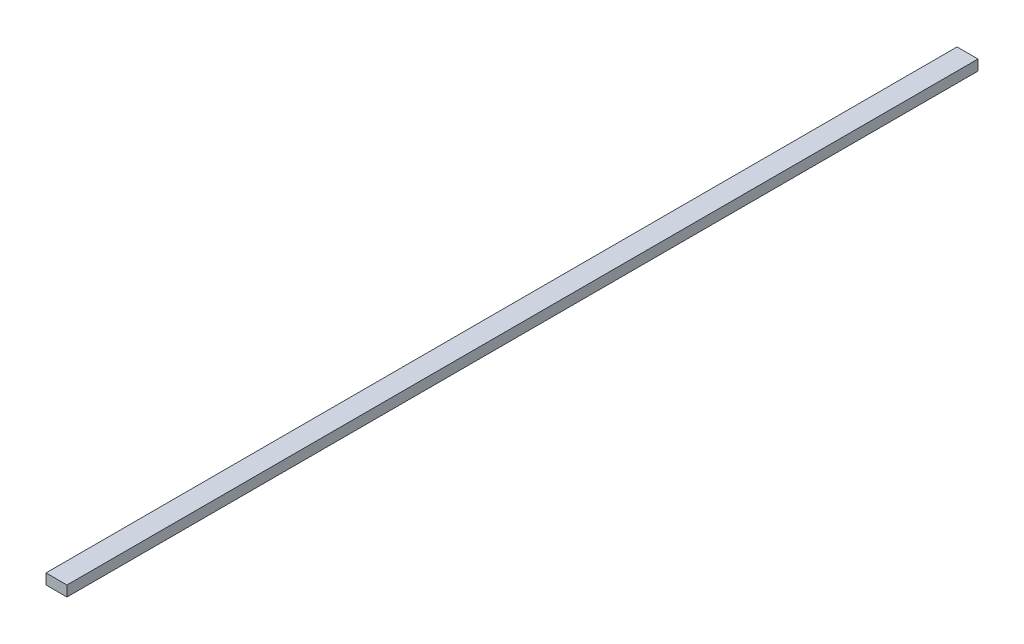
ISO-10303-21;
HEADER;
FILE_DESCRIPTION(('STEP AP214'),'2;1');
FILE_NAME('part.step','',(''),(''),'','','');
FILE_SCHEMA(('AUTOMOTIVE_DESIGN { 1 0 10303 214 1 1 1 1 }'));
ENDSEC;
DATA;
#1=APPLICATION_CONTEXT('core data for automotive mechanical design processes');
#2=APPLICATION_PROTOCOL_DEFINITION('international standard','automotive_design',2000,#1);
#3=PRODUCT_CONTEXT('',#1,'mechanical');
#4=PRODUCT('Part','Part','',(#3));
#5=PRODUCT_RELATED_PRODUCT_CATEGORY('part','',(#4));
#6=PRODUCT_DEFINITION_FORMATION('','',#4);
#7=PRODUCT_DEFINITION_CONTEXT('part definition',#1,'design');
#8=PRODUCT_DEFINITION('design','',#6,#7);
#9=PRODUCT_DEFINITION_SHAPE('','',#8);
#10=(LENGTH_UNIT() NAMED_UNIT(*) SI_UNIT(.MILLI.,.METRE.));
#11=(NAMED_UNIT(*) PLANE_ANGLE_UNIT() SI_UNIT($,.RADIAN.));
#12=(NAMED_UNIT(*) SI_UNIT($,.STERADIAN.) SOLID_ANGLE_UNIT());
#13=UNCERTAINTY_MEASURE_WITH_UNIT(LENGTH_MEASURE(1.E-05),#10,'distance_accuracy_value','');
#14=(GEOMETRIC_REPRESENTATION_CONTEXT(3) GLOBAL_UNCERTAINTY_ASSIGNED_CONTEXT((#13)) GLOBAL_UNIT_ASSIGNED_CONTEXT((#10,
#11,#12)) REPRESENTATION_CONTEXT('',''));
#15=CARTESIAN_POINT('',(0.,0.,0.));
#16=DIRECTION('',(0.,0.,1.));
#17=DIRECTION('',(1.,0.,0.));
#18=AXIS2_PLACEMENT_3D('',#15,#16,#17);
#19=CARTESIAN_POINT('',(0.,12.7,0.));
#20=DIRECTION('',(1.,0.,0.));
#21=DIRECTION('',(0.,0.,-1.));
#22=AXIS2_PLACEMENT_3D('',#19,#20,#21);
#23=PLANE('',#22);
#24=DIRECTION('',(0.,0.,1.));
#25=VECTOR('',#24,1.);
#26=CARTESIAN_POINT('',(0.,0.,0.));
#27=LINE('',#26,#25);
#28=CARTESIAN_POINT('',(0.,0.,-1104.9));
#29=VERTEX_POINT('',#28);
#30=CARTESIAN_POINT('',(0.,0.,0.));
#31=VERTEX_POINT('',#30);
#32=EDGE_CURVE('E107',#29,#31,#27,.T.);
#33=ORIENTED_EDGE('',*,*,#32,.T.);
#34=DIRECTION('',(0.,-1.,0.));
#35=VECTOR('',#34,1.);
#36=CARTESIAN_POINT('',(0.,12.7,0.));
#37=LINE('',#36,#35);
#38=CARTESIAN_POINT('',(0.,12.7,0.));
#39=VERTEX_POINT('',#38);
#40=EDGE_CURVE('E11',#39,#31,#37,.T.);
#41=ORIENTED_EDGE('',*,*,#40,.F.);
#42=DIRECTION('',(0.,0.,1.));
#43=VECTOR('',#42,1.);
#44=CARTESIAN_POINT('',(0.,12.7,0.));
#45=LINE('',#44,#43);
#46=CARTESIAN_POINT('',(0.,12.7,-1104.9));
#47=VERTEX_POINT('',#46);
#48=EDGE_CURVE('E91',#47,#39,#45,.T.);
#49=ORIENTED_EDGE('',*,*,#48,.F.);
#50=DIRECTION('',(0.,-1.,0.));
#51=VECTOR('',#50,1.);
#52=CARTESIAN_POINT('',(0.,12.7,-1104.9));
#53=LINE('',#52,#51);
#54=EDGE_CURVE('E103',#47,#29,#53,.T.);
#55=ORIENTED_EDGE('',*,*,#54,.T.);
#56=EDGE_LOOP('',(#33,#41,#49,#55));
#57=FACE_BOUND('',#56,.T.);
#58=ADVANCED_FACE('F39',(#57),#23,.F.);
#59=CARTESIAN_POINT('',(0.,12.7,0.));
#60=DIRECTION('',(0.,0.,-1.));
#61=DIRECTION('',(-1.,0.,0.));
#62=AXIS2_PLACEMENT_3D('',#59,#60,#61);
#63=PLANE('',#62);
#64=DIRECTION('',(1.,0.,0.));
#65=VECTOR('',#64,1.);
#66=CARTESIAN_POINT('',(0.,0.,0.));
#67=LINE('',#66,#65);
#68=CARTESIAN_POINT('',(25.4,0.,0.));
#69=VERTEX_POINT('',#68);
#70=EDGE_CURVE('E96',#31,#69,#67,.T.);
#71=ORIENTED_EDGE('',*,*,#70,.T.);
#72=DIRECTION('',(0.,-1.,0.));
#73=VECTOR('',#72,1.);
#74=CARTESIAN_POINT('',(25.4,12.7,0.));
#75=LINE('',#74,#73);
#76=CARTESIAN_POINT('',(25.4,12.7,0.));
#77=VERTEX_POINT('',#76);
#78=EDGE_CURVE('E48',#77,#69,#75,.T.);
#79=ORIENTED_EDGE('',*,*,#78,.F.);
#80=DIRECTION('',(1.,0.,0.));
#81=VECTOR('',#80,1.);
#82=CARTESIAN_POINT('',(0.,12.7,0.));
#83=LINE('',#82,#81);
#84=EDGE_CURVE('E86',#39,#77,#83,.T.);
#85=ORIENTED_EDGE('',*,*,#84,.F.);
#86=ORIENTED_EDGE('',*,*,#40,.T.);
#87=EDGE_LOOP('',(#71,#79,#85,#86));
#88=FACE_BOUND('',#87,.T.);
#89=ADVANCED_FACE('F95',(#88),#63,.F.);
#90=CARTESIAN_POINT('',(25.4,12.7,0.));
#91=DIRECTION('',(-1.,0.,0.));
#92=DIRECTION('',(0.,0.,1.));
#93=AXIS2_PLACEMENT_3D('',#90,#91,#92);
#94=PLANE('',#93);
#95=DIRECTION('',(0.,0.,-1.));
#96=VECTOR('',#95,1.);
#97=CARTESIAN_POINT('',(25.4,0.,0.));
#98=LINE('',#97,#96);
#99=CARTESIAN_POINT('',(25.4,0.,-1104.9));
#100=VERTEX_POINT('',#99);
#101=EDGE_CURVE('E73',#69,#100,#98,.T.);
#102=ORIENTED_EDGE('',*,*,#101,.T.);
#103=DIRECTION('',(0.,-1.,0.));
#104=VECTOR('',#103,1.);
#105=CARTESIAN_POINT('',(25.4,12.7,-1104.9));
#106=LINE('',#105,#104);
#107=CARTESIAN_POINT('',(25.4,12.7,-1104.9));
#108=VERTEX_POINT('',#107);
#109=EDGE_CURVE('E98',#108,#100,#106,.T.);
#110=ORIENTED_EDGE('',*,*,#109,.F.);
#111=DIRECTION('',(0.,0.,-1.));
#112=VECTOR('',#111,1.);
#113=CARTESIAN_POINT('',(25.4,12.7,0.));
#114=LINE('',#113,#112);
#115=EDGE_CURVE('E89',#77,#108,#114,.T.);
#116=ORIENTED_EDGE('',*,*,#115,.F.);
#117=ORIENTED_EDGE('',*,*,#78,.T.);
#118=EDGE_LOOP('',(#102,#110,#116,#117));
#119=FACE_BOUND('',#118,.T.);
#120=ADVANCED_FACE('F99',(#119),#94,.F.);
#121=CARTESIAN_POINT('',(0.,12.7,-1104.9));
#122=DIRECTION('',(0.,0.,1.));
#123=DIRECTION('',(1.,0.,0.));
#124=AXIS2_PLACEMENT_3D('',#121,#122,#123);
#125=PLANE('',#124);
#126=DIRECTION('',(-1.,0.,0.));
#127=VECTOR('',#126,1.);
#128=CARTESIAN_POINT('',(0.,0.,-1104.9));
#129=LINE('',#128,#127);
#130=EDGE_CURVE('E79',#100,#29,#129,.T.);
#131=ORIENTED_EDGE('',*,*,#130,.T.);
#132=ORIENTED_EDGE('',*,*,#54,.F.);
#133=DIRECTION('',(-1.,0.,0.));
#134=VECTOR('',#133,1.);
#135=CARTESIAN_POINT('',(0.,12.7,-1104.9));
#136=LINE('',#135,#134);
#137=EDGE_CURVE('E56',#108,#47,#136,.T.);
#138=ORIENTED_EDGE('',*,*,#137,.F.);
#139=ORIENTED_EDGE('',*,*,#109,.T.);
#140=EDGE_LOOP('',(#131,#132,#138,#139));
#141=FACE_BOUND('',#140,.T.);
#142=ADVANCED_FACE('F120',(#141),#125,.F.);
#143=CARTESIAN_POINT('',(0.,12.7,0.));
#144=DIRECTION('',(0.,-1.,0.));
#145=DIRECTION('',(0.,0.,-1.));
#146=AXIS2_PLACEMENT_3D('',#143,#144,#145);
#147=PLANE('',#146);
#148=ORIENTED_EDGE('',*,*,#48,.T.);
#149=ORIENTED_EDGE('',*,*,#84,.T.);
#150=ORIENTED_EDGE('',*,*,#115,.T.);
#151=ORIENTED_EDGE('',*,*,#137,.T.);
#152=EDGE_LOOP('',(#148,#149,#150,#151));
#153=FACE_BOUND('',#152,.T.);
#154=ADVANCED_FACE('F87',(#153),#147,.F.);
#155=CARTESIAN_POINT('',(0.,0.,0.));
#156=DIRECTION('',(0.,-1.,0.));
#157=DIRECTION('',(0.,0.,-1.));
#158=AXIS2_PLACEMENT_3D('',#155,#156,#157);
#159=PLANE('',#158);
#160=ORIENTED_EDGE('',*,*,#32,.F.);
#161=ORIENTED_EDGE('',*,*,#130,.F.);
#162=ORIENTED_EDGE('',*,*,#101,.F.);
#163=ORIENTED_EDGE('',*,*,#70,.F.);
#164=EDGE_LOOP('',(#160,#161,#162,#163));
#165=FACE_BOUND('',#164,.T.);
#166=ADVANCED_FACE('F123',(#165),#159,.T.);
#167=CLOSED_SHELL('',(#58,#89,#120,#142,#154,#166));
#168=MANIFOLD_SOLID_BREP('B2',#167);
#169=ADVANCED_BREP_SHAPE_REPRESENTATION('',(#18,#168),#14);
#170=SHAPE_DEFINITION_REPRESENTATION(#9,#169);
ENDSEC;
END-ISO-10303-21;
